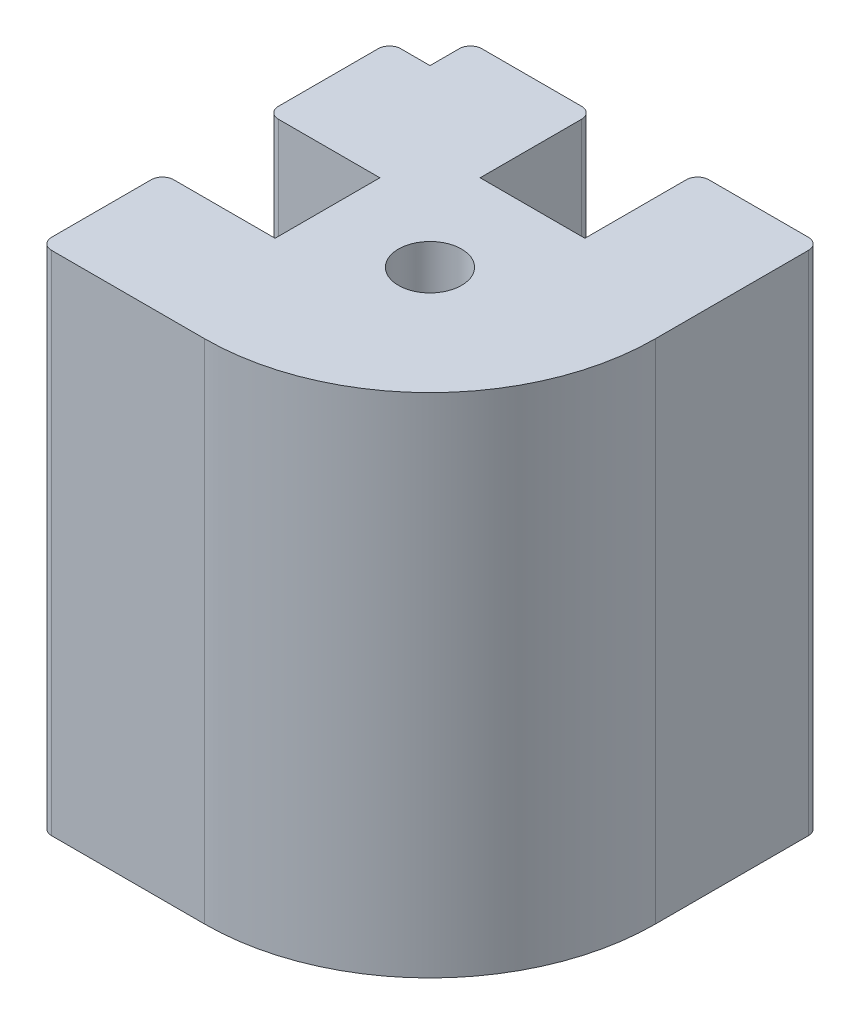
ISO-10303-21;
HEADER;
FILE_DESCRIPTION(('STEP AP214'),'2;1');
FILE_NAME('part.step','',(''),(''),'','','');
FILE_SCHEMA(('AUTOMOTIVE_DESIGN { 1 0 10303 214 1 1 1 1 }'));
ENDSEC;
DATA;
#1=APPLICATION_CONTEXT('core data for automotive mechanical design processes');
#2=APPLICATION_PROTOCOL_DEFINITION('international standard','automotive_design',2000,#1);
#3=PRODUCT_CONTEXT('',#1,'mechanical');
#4=PRODUCT('Part','Part','',(#3));
#5=PRODUCT_RELATED_PRODUCT_CATEGORY('part','',(#4));
#6=PRODUCT_DEFINITION_FORMATION('','',#4);
#7=PRODUCT_DEFINITION_CONTEXT('part definition',#1,'design');
#8=PRODUCT_DEFINITION('design','',#6,#7);
#9=PRODUCT_DEFINITION_SHAPE('','',#8);
#10=(LENGTH_UNIT() NAMED_UNIT(*) SI_UNIT(.MILLI.,.METRE.));
#11=(NAMED_UNIT(*) PLANE_ANGLE_UNIT() SI_UNIT($,.RADIAN.));
#12=(NAMED_UNIT(*) SI_UNIT($,.STERADIAN.) SOLID_ANGLE_UNIT());
#13=UNCERTAINTY_MEASURE_WITH_UNIT(LENGTH_MEASURE(1.E-05),#10,'distance_accuracy_value','');
#14=(GEOMETRIC_REPRESENTATION_CONTEXT(3) GLOBAL_UNCERTAINTY_ASSIGNED_CONTEXT((#13)) GLOBAL_UNIT_ASSIGNED_CONTEXT((#10,
#11,#12)) REPRESENTATION_CONTEXT('',''));
#15=CARTESIAN_POINT('',(0.,0.,0.));
#16=DIRECTION('',(0.,0.,1.));
#17=DIRECTION('',(1.,0.,0.));
#18=AXIS2_PLACEMENT_3D('',#15,#16,#17);
#19=CARTESIAN_POINT('',(0.,45.,0.));
#20=DIRECTION('',(0.,-1.,0.));
#21=DIRECTION('',(0.,0.,-1.));
#22=AXIS2_PLACEMENT_3D('',#19,#20,#21);
#23=PLANE('',#22);
#24=DIRECTION('',(1.,0.,0.));
#25=VECTOR('',#24,1.);
#26=CARTESIAN_POINT('',(15.5,45.,15.5));
#27=LINE('',#26,#25);
#28=CARTESIAN_POINT('',(-18.0991525423729,45.,15.5));
#29=VERTEX_POINT('',#28);
#30=CARTESIAN_POINT('',(-4.49999999999999,45.,15.5));
#31=VERTEX_POINT('',#30);
#32=EDGE_CURVE('E316',#29,#31,#27,.T.);
#33=ORIENTED_EDGE('',*,*,#32,.T.);
#34=CARTESIAN_POINT('',(-4.5,45.,-4.5));
#35=DIRECTION('',(0.,-1.,0.));
#36=DIRECTION('',(0.,0.,-1.));
#37=AXIS2_PLACEMENT_3D('',#34,#35,#36);
#38=CIRCLE('',#37,20.);
#39=CARTESIAN_POINT('',(15.5,45.,-4.5));
#40=VERTEX_POINT('',#39);
#41=EDGE_CURVE('E11',#31,#40,#38,.F.);
#42=ORIENTED_EDGE('',*,*,#41,.T.);
#43=DIRECTION('',(0.,0.,-1.));
#44=VECTOR('',#43,1.);
#45=CARTESIAN_POINT('',(15.5,45.,-19.0991525423729));
#46=LINE('',#45,#44);
#47=CARTESIAN_POINT('',(15.5,45.,-18.0991525423729));
#48=VERTEX_POINT('',#47);
#49=EDGE_CURVE('E444',#40,#48,#46,.T.);
#50=ORIENTED_EDGE('',*,*,#49,.T.);
#51=CARTESIAN_POINT('',(14.5,45.,-18.0991525423729));
#52=DIRECTION('',(0.,-1.,0.));
#53=DIRECTION('',(0.,0.,-1.));
#54=AXIS2_PLACEMENT_3D('',#51,#52,#53);
#55=CIRCLE('',#54,1.);
#56=CARTESIAN_POINT('',(14.5,45.,-19.0991525423729));
#57=VERTEX_POINT('',#56);
#58=EDGE_CURVE('E384',#48,#57,#55,.F.);
#59=ORIENTED_EDGE('',*,*,#58,.T.);
#60=DIRECTION('',(-1.,0.,0.));
#61=VECTOR('',#60,1.);
#62=CARTESIAN_POINT('',(4.65000000000002,45.,-19.0991525423729));
#63=LINE('',#62,#61);
#64=CARTESIAN_POINT('',(5.65000000000002,45.,-19.0991525423729));
#65=VERTEX_POINT('',#64);
#66=EDGE_CURVE('E212',#57,#65,#63,.T.);
#67=ORIENTED_EDGE('',*,*,#66,.T.);
#68=CARTESIAN_POINT('',(5.65000000000002,45.,-18.0991525423729));
#69=DIRECTION('',(0.,-1.,0.));
#70=DIRECTION('',(0.,0.,-1.));
#71=AXIS2_PLACEMENT_3D('',#68,#69,#70);
#72=CIRCLE('',#71,1.);
#73=CARTESIAN_POINT('',(4.65000000000002,45.,-18.0991525423729));
#74=VERTEX_POINT('',#73);
#75=EDGE_CURVE('E207',#65,#74,#72,.F.);
#76=ORIENTED_EDGE('',*,*,#75,.T.);
#77=DIRECTION('',(0.,0.,1.));
#78=VECTOR('',#77,1.);
#79=CARTESIAN_POINT('',(4.64999999999999,45.,-9.09915254237289));
#80=LINE('',#79,#78);
#81=CARTESIAN_POINT('',(4.64999999999999,45.,-9.09915254237289));
#82=VERTEX_POINT('',#81);
#83=EDGE_CURVE('E199',#74,#82,#80,.T.);
#84=ORIENTED_EDGE('',*,*,#83,.T.);
#85=DIRECTION('',(-1.,0.,0.));
#86=VECTOR('',#85,1.);
#87=CARTESIAN_POINT('',(-4.65000000000001,45.,-9.09915254237288));
#88=LINE('',#87,#86);
#89=CARTESIAN_POINT('',(-4.65000000000001,45.,-9.09915254237288));
#90=VERTEX_POINT('',#89);
#91=EDGE_CURVE('E202',#82,#90,#88,.T.);
#92=ORIENTED_EDGE('',*,*,#91,.T.);
#93=DIRECTION('',(0.,0.,-1.));
#94=VECTOR('',#93,1.);
#95=CARTESIAN_POINT('',(-4.65000000000002,45.,-19.0991525423729));
#96=LINE('',#95,#94);
#97=CARTESIAN_POINT('',(-4.65000000000002,45.,-18.0991525423729));
#98=VERTEX_POINT('',#97);
#99=EDGE_CURVE('E231',#90,#98,#96,.T.);
#100=ORIENTED_EDGE('',*,*,#99,.T.);
#101=CARTESIAN_POINT('',(-5.65000000000002,45.,-18.0991525423729));
#102=DIRECTION('',(0.,-1.,0.));
#103=DIRECTION('',(0.,0.,-1.));
#104=AXIS2_PLACEMENT_3D('',#101,#102,#103);
#105=CIRCLE('',#104,1.);
#106=CARTESIAN_POINT('',(-5.65000000000002,45.,-19.0991525423729));
#107=VERTEX_POINT('',#106);
#108=EDGE_CURVE('E379',#98,#107,#105,.F.);
#109=ORIENTED_EDGE('',*,*,#108,.T.);
#110=DIRECTION('',(-1.,0.,0.));
#111=VECTOR('',#110,1.);
#112=CARTESIAN_POINT('',(-15.5,45.,-19.0991525423729));
#113=LINE('',#112,#111);
#114=CARTESIAN_POINT('',(-14.5,45.,-19.0991525423729));
#115=VERTEX_POINT('',#114);
#116=EDGE_CURVE('E233',#107,#115,#113,.T.);
#117=ORIENTED_EDGE('',*,*,#116,.T.);
#118=CARTESIAN_POINT('',(-14.5,45.,-18.0991525423729));
#119=DIRECTION('',(0.,-1.,0.));
#120=DIRECTION('',(0.,0.,-1.));
#121=AXIS2_PLACEMENT_3D('',#118,#119,#120);
#122=CIRCLE('',#121,1.);
#123=CARTESIAN_POINT('',(-15.5,45.,-18.0991525423729));
#124=VERTEX_POINT('',#123);
#125=EDGE_CURVE('E380',#115,#124,#122,.F.);
#126=ORIENTED_EDGE('',*,*,#125,.T.);
#127=DIRECTION('',(0.,0.,1.));
#128=VECTOR('',#127,1.);
#129=CARTESIAN_POINT('',(-15.5,45.,-15.5));
#130=LINE('',#129,#128);
#131=CARTESIAN_POINT('',(-15.5,45.,-15.5));
#132=VERTEX_POINT('',#131);
#133=EDGE_CURVE('E241',#124,#132,#130,.T.);
#134=ORIENTED_EDGE('',*,*,#133,.T.);
#135=DIRECTION('',(-1.,0.,0.));
#136=VECTOR('',#135,1.);
#137=CARTESIAN_POINT('',(-19.0991525423729,45.,-15.5));
#138=LINE('',#137,#136);
#139=CARTESIAN_POINT('',(-18.0991525423729,45.,-15.5));
#140=VERTEX_POINT('',#139);
#141=EDGE_CURVE('E243',#132,#140,#138,.T.);
#142=ORIENTED_EDGE('',*,*,#141,.T.);
#143=CARTESIAN_POINT('',(-18.0991525423729,45.,-14.5));
#144=DIRECTION('',(0.,-1.,0.));
#145=DIRECTION('',(0.,0.,-1.));
#146=AXIS2_PLACEMENT_3D('',#143,#144,#145);
#147=CIRCLE('',#146,1.);
#148=CARTESIAN_POINT('',(-19.0991525423729,45.,-14.5));
#149=VERTEX_POINT('',#148);
#150=EDGE_CURVE('E372',#140,#149,#147,.F.);
#151=ORIENTED_EDGE('',*,*,#150,.T.);
#152=DIRECTION('',(0.,0.,1.));
#153=VECTOR('',#152,1.);
#154=CARTESIAN_POINT('',(-19.0991525423729,45.,-4.65));
#155=LINE('',#154,#153);
#156=CARTESIAN_POINT('',(-19.0991525423729,45.,-5.65));
#157=VERTEX_POINT('',#156);
#158=EDGE_CURVE('E247',#149,#157,#155,.T.);
#159=ORIENTED_EDGE('',*,*,#158,.T.);
#160=CARTESIAN_POINT('',(-18.0991525423729,45.,-5.65));
#161=DIRECTION('',(0.,-1.,0.));
#162=DIRECTION('',(0.,0.,-1.));
#163=AXIS2_PLACEMENT_3D('',#160,#161,#162);
#164=CIRCLE('',#163,1.);
#165=CARTESIAN_POINT('',(-18.0991525423729,45.,-4.65));
#166=VERTEX_POINT('',#165);
#167=EDGE_CURVE('E366',#157,#166,#164,.F.);
#168=ORIENTED_EDGE('',*,*,#167,.T.);
#169=DIRECTION('',(1.,0.,0.));
#170=VECTOR('',#169,1.);
#171=CARTESIAN_POINT('',(-9.09915254237288,45.,-4.65));
#172=LINE('',#171,#170);
#173=CARTESIAN_POINT('',(-9.09915254237288,45.,-4.65));
#174=VERTEX_POINT('',#173);
#175=EDGE_CURVE('E252',#166,#174,#172,.T.);
#176=ORIENTED_EDGE('',*,*,#175,.T.);
#177=DIRECTION('',(0.,0.,1.));
#178=VECTOR('',#177,1.);
#179=CARTESIAN_POINT('',(-9.09915254237288,45.,4.65));
#180=LINE('',#179,#178);
#181=CARTESIAN_POINT('',(-9.09915254237288,45.,4.65));
#182=VERTEX_POINT('',#181);
#183=EDGE_CURVE('E254',#174,#182,#180,.T.);
#184=ORIENTED_EDGE('',*,*,#183,.T.);
#185=DIRECTION('',(-1.,0.,0.));
#186=VECTOR('',#185,1.);
#187=CARTESIAN_POINT('',(-19.0991525423729,45.,4.65));
#188=LINE('',#187,#186);
#189=CARTESIAN_POINT('',(-18.0991525423729,45.,4.65));
#190=VERTEX_POINT('',#189);
#191=EDGE_CURVE('E256',#182,#190,#188,.T.);
#192=ORIENTED_EDGE('',*,*,#191,.T.);
#193=CARTESIAN_POINT('',(-18.0991525423729,45.,5.65));
#194=DIRECTION('',(0.,-1.,0.));
#195=DIRECTION('',(0.,0.,-1.));
#196=AXIS2_PLACEMENT_3D('',#193,#194,#195);
#197=CIRCLE('',#196,1.);
#198=CARTESIAN_POINT('',(-19.0991525423729,45.,5.65));
#199=VERTEX_POINT('',#198);
#200=EDGE_CURVE('E371',#190,#199,#197,.F.);
#201=ORIENTED_EDGE('',*,*,#200,.T.);
#202=DIRECTION('',(0.,0.,1.));
#203=VECTOR('',#202,1.);
#204=CARTESIAN_POINT('',(-19.0991525423729,45.,15.5));
#205=LINE('',#204,#203);
#206=CARTESIAN_POINT('',(-19.0991525423729,45.,14.5));
#207=VERTEX_POINT('',#206);
#208=EDGE_CURVE('E265',#199,#207,#205,.T.);
#209=ORIENTED_EDGE('',*,*,#208,.T.);
#210=CARTESIAN_POINT('',(-18.0991525423729,45.,14.5));
#211=DIRECTION('',(0.,-1.,0.));
#212=DIRECTION('',(0.,0.,-1.));
#213=AXIS2_PLACEMENT_3D('',#210,#211,#212);
#214=CIRCLE('',#213,1.);
#215=EDGE_CURVE('E364',#207,#29,#214,.F.);
#216=ORIENTED_EDGE('',*,*,#215,.T.);
#217=EDGE_LOOP('',(#33,#42,#50,#59,#67,#76,#84,#92,#100,#109,#117,#126,#134,#142,#151,#159,#168,
#176,#184,#192,#201,#209,#216));
#218=FACE_BOUND('',#217,.T.);
#219=CARTESIAN_POINT('',(0.,45.,0.));
#220=DIRECTION('',(0.,1.,0.));
#221=DIRECTION('',(0.,0.,1.));
#222=AXIS2_PLACEMENT_3D('',#219,#220,#221);
#223=CIRCLE('',#222,2.8);
#224=CARTESIAN_POINT('',(0.,45.,-2.8));
#225=VERTEX_POINT('',#224);
#226=EDGE_CURVE('E271',#225,#225,#223,.T.);
#227=ORIENTED_EDGE('',*,*,#226,.F.);
#228=EDGE_LOOP('',(#227));
#229=FACE_BOUND('',#228,.T.);
#230=ADVANCED_FACE('F44',(#218,#229),#23,.F.);
#231=CARTESIAN_POINT('',(0.,0.,0.));
#232=DIRECTION('',(0.,-1.,0.));
#233=DIRECTION('',(0.,0.,-1.));
#234=AXIS2_PLACEMENT_3D('',#231,#232,#233);
#235=PLANE('',#234);
#236=DIRECTION('',(0.,0.,-1.));
#237=VECTOR('',#236,1.);
#238=CARTESIAN_POINT('',(15.5,0.,-19.0991525423729));
#239=LINE('',#238,#237);
#240=CARTESIAN_POINT('',(15.5,0.,-4.5));
#241=VERTEX_POINT('',#240);
#242=CARTESIAN_POINT('',(15.5,0.,-18.0991525423729));
#243=VERTEX_POINT('',#242);
#244=EDGE_CURVE('E269',#241,#243,#239,.T.);
#245=ORIENTED_EDGE('',*,*,#244,.F.);
#246=CARTESIAN_POINT('',(-4.5,0.,-4.5));
#247=DIRECTION('',(0.,-1.,0.));
#248=DIRECTION('',(0.,0.,-1.));
#249=AXIS2_PLACEMENT_3D('',#246,#247,#248);
#250=CIRCLE('',#249,20.);
#251=CARTESIAN_POINT('',(-4.49999999999999,0.,15.5));
#252=VERTEX_POINT('',#251);
#253=EDGE_CURVE('E67',#241,#252,#250,.T.);
#254=ORIENTED_EDGE('',*,*,#253,.T.);
#255=DIRECTION('',(1.,0.,0.));
#256=VECTOR('',#255,1.);
#257=CARTESIAN_POINT('',(15.5,0.,15.5));
#258=LINE('',#257,#256);
#259=CARTESIAN_POINT('',(-18.0991525423729,0.,15.5));
#260=VERTEX_POINT('',#259);
#261=EDGE_CURVE('E270',#260,#252,#258,.T.);
#262=ORIENTED_EDGE('',*,*,#261,.F.);
#263=CARTESIAN_POINT('',(-18.0991525423729,0.,14.5));
#264=DIRECTION('',(0.,-1.,0.));
#265=DIRECTION('',(0.,0.,-1.));
#266=AXIS2_PLACEMENT_3D('',#263,#264,#265);
#267=CIRCLE('',#266,1.);
#268=CARTESIAN_POINT('',(-19.0991525423729,0.,14.5));
#269=VERTEX_POINT('',#268);
#270=EDGE_CURVE('E336',#260,#269,#267,.T.);
#271=ORIENTED_EDGE('',*,*,#270,.T.);
#272=DIRECTION('',(0.,0.,1.));
#273=VECTOR('',#272,1.);
#274=CARTESIAN_POINT('',(-19.0991525423729,0.,15.5));
#275=LINE('',#274,#273);
#276=CARTESIAN_POINT('',(-19.0991525423729,0.,5.65));
#277=VERTEX_POINT('',#276);
#278=EDGE_CURVE('E315',#277,#269,#275,.T.);
#279=ORIENTED_EDGE('',*,*,#278,.F.);
#280=CARTESIAN_POINT('',(-18.0991525423729,0.,5.65));
#281=DIRECTION('',(0.,-1.,0.));
#282=DIRECTION('',(0.,0.,-1.));
#283=AXIS2_PLACEMENT_3D('',#280,#281,#282);
#284=CIRCLE('',#283,1.);
#285=CARTESIAN_POINT('',(-18.0991525423729,0.,4.65));
#286=VERTEX_POINT('',#285);
#287=EDGE_CURVE('E345',#277,#286,#284,.T.);
#288=ORIENTED_EDGE('',*,*,#287,.T.);
#289=DIRECTION('',(-1.,0.,0.));
#290=VECTOR('',#289,1.);
#291=CARTESIAN_POINT('',(-19.0991525423729,0.,4.65));
#292=LINE('',#291,#290);
#293=CARTESIAN_POINT('',(-9.09915254237288,0.,4.65));
#294=VERTEX_POINT('',#293);
#295=EDGE_CURVE('E306',#294,#286,#292,.T.);
#296=ORIENTED_EDGE('',*,*,#295,.F.);
#297=DIRECTION('',(0.,0.,1.));
#298=VECTOR('',#297,1.);
#299=CARTESIAN_POINT('',(-9.09915254237288,0.,4.65));
#300=LINE('',#299,#298);
#301=CARTESIAN_POINT('',(-9.09915254237288,0.,-4.65));
#302=VERTEX_POINT('',#301);
#303=EDGE_CURVE('E304',#302,#294,#300,.T.);
#304=ORIENTED_EDGE('',*,*,#303,.F.);
#305=DIRECTION('',(1.,0.,0.));
#306=VECTOR('',#305,1.);
#307=CARTESIAN_POINT('',(-9.09915254237288,0.,-4.65));
#308=LINE('',#307,#306);
#309=CARTESIAN_POINT('',(-18.0991525423729,0.,-4.65));
#310=VERTEX_POINT('',#309);
#311=EDGE_CURVE('E305',#310,#302,#308,.T.);
#312=ORIENTED_EDGE('',*,*,#311,.F.);
#313=CARTESIAN_POINT('',(-18.0991525423729,0.,-5.65));
#314=DIRECTION('',(0.,-1.,0.));
#315=DIRECTION('',(0.,0.,-1.));
#316=AXIS2_PLACEMENT_3D('',#313,#314,#315);
#317=CIRCLE('',#316,1.);
#318=CARTESIAN_POINT('',(-19.0991525423729,0.,-5.65));
#319=VERTEX_POINT('',#318);
#320=EDGE_CURVE('E338',#310,#319,#317,.T.);
#321=ORIENTED_EDGE('',*,*,#320,.T.);
#322=DIRECTION('',(0.,0.,1.));
#323=VECTOR('',#322,1.);
#324=CARTESIAN_POINT('',(-19.0991525423729,0.,-4.65));
#325=LINE('',#324,#323);
#326=CARTESIAN_POINT('',(-19.0991525423729,0.,-14.5));
#327=VERTEX_POINT('',#326);
#328=EDGE_CURVE('E297',#327,#319,#325,.T.);
#329=ORIENTED_EDGE('',*,*,#328,.F.);
#330=CARTESIAN_POINT('',(-18.0991525423729,0.,-14.5));
#331=DIRECTION('',(0.,-1.,0.));
#332=DIRECTION('',(0.,0.,-1.));
#333=AXIS2_PLACEMENT_3D('',#330,#331,#332);
#334=CIRCLE('',#333,1.);
#335=CARTESIAN_POINT('',(-18.0991525423729,0.,-15.5));
#336=VERTEX_POINT('',#335);
#337=EDGE_CURVE('E344',#327,#336,#334,.T.);
#338=ORIENTED_EDGE('',*,*,#337,.T.);
#339=DIRECTION('',(-1.,0.,0.));
#340=VECTOR('',#339,1.);
#341=CARTESIAN_POINT('',(-19.0991525423729,0.,-15.5));
#342=LINE('',#341,#340);
#343=CARTESIAN_POINT('',(-15.5,0.,-15.5));
#344=VERTEX_POINT('',#343);
#345=EDGE_CURVE('E294',#344,#336,#342,.T.);
#346=ORIENTED_EDGE('',*,*,#345,.F.);
#347=DIRECTION('',(0.,0.,1.));
#348=VECTOR('',#347,1.);
#349=CARTESIAN_POINT('',(-15.5,0.,-15.5));
#350=LINE('',#349,#348);
#351=CARTESIAN_POINT('',(-15.5,0.,-18.0991525423729));
#352=VERTEX_POINT('',#351);
#353=EDGE_CURVE('E292',#352,#344,#350,.T.);
#354=ORIENTED_EDGE('',*,*,#353,.F.);
#355=CARTESIAN_POINT('',(-14.5,0.,-18.0991525423729));
#356=DIRECTION('',(0.,-1.,0.));
#357=DIRECTION('',(0.,0.,-1.));
#358=AXIS2_PLACEMENT_3D('',#355,#356,#357);
#359=CIRCLE('',#358,1.);
#360=CARTESIAN_POINT('',(-14.5,0.,-19.0991525423729));
#361=VERTEX_POINT('',#360);
#362=EDGE_CURVE('E346',#352,#361,#359,.T.);
#363=ORIENTED_EDGE('',*,*,#362,.T.);
#364=DIRECTION('',(-1.,0.,0.));
#365=VECTOR('',#364,1.);
#366=CARTESIAN_POINT('',(-15.5,0.,-19.0991525423729));
#367=LINE('',#366,#365);
#368=CARTESIAN_POINT('',(-5.65000000000002,0.,-19.0991525423729));
#369=VERTEX_POINT('',#368);
#370=EDGE_CURVE('E290',#369,#361,#367,.T.);
#371=ORIENTED_EDGE('',*,*,#370,.F.);
#372=CARTESIAN_POINT('',(-5.65000000000002,0.,-18.0991525423729));
#373=DIRECTION('',(0.,-1.,0.));
#374=DIRECTION('',(0.,0.,-1.));
#375=AXIS2_PLACEMENT_3D('',#372,#373,#374);
#376=CIRCLE('',#375,1.);
#377=CARTESIAN_POINT('',(-4.65000000000002,0.,-18.0991525423729));
#378=VERTEX_POINT('',#377);
#379=EDGE_CURVE('E351',#369,#378,#376,.T.);
#380=ORIENTED_EDGE('',*,*,#379,.T.);
#381=DIRECTION('',(0.,0.,-1.));
#382=VECTOR('',#381,1.);
#383=CARTESIAN_POINT('',(-4.65000000000002,0.,-19.0991525423729));
#384=LINE('',#383,#382);
#385=CARTESIAN_POINT('',(-4.65000000000001,0.,-9.09915254237288));
#386=VERTEX_POINT('',#385);
#387=EDGE_CURVE('E282',#386,#378,#384,.T.);
#388=ORIENTED_EDGE('',*,*,#387,.F.);
#389=DIRECTION('',(-1.,0.,0.));
#390=VECTOR('',#389,1.);
#391=CARTESIAN_POINT('',(-4.65000000000001,0.,-9.09915254237288));
#392=LINE('',#391,#390);
#393=CARTESIAN_POINT('',(4.64999999999999,0.,-9.09915254237289));
#394=VERTEX_POINT('',#393);
#395=EDGE_CURVE('E278',#394,#386,#392,.T.);
#396=ORIENTED_EDGE('',*,*,#395,.F.);
#397=DIRECTION('',(0.,0.,1.));
#398=VECTOR('',#397,1.);
#399=CARTESIAN_POINT('',(4.64999999999999,0.,-9.09915254237289));
#400=LINE('',#399,#398);
#401=CARTESIAN_POINT('',(4.65000000000002,0.,-18.0991525423729));
#402=VERTEX_POINT('',#401);
#403=EDGE_CURVE('E219',#402,#394,#400,.T.);
#404=ORIENTED_EDGE('',*,*,#403,.F.);
#405=CARTESIAN_POINT('',(5.65000000000002,0.,-18.0991525423729));
#406=DIRECTION('',(0.,-1.,0.));
#407=DIRECTION('',(0.,0.,-1.));
#408=AXIS2_PLACEMENT_3D('',#405,#406,#407);
#409=CIRCLE('',#408,1.);
#410=CARTESIAN_POINT('',(5.65000000000002,0.,-19.0991525423729));
#411=VERTEX_POINT('',#410);
#412=EDGE_CURVE('E353',#402,#411,#409,.T.);
#413=ORIENTED_EDGE('',*,*,#412,.T.);
#414=DIRECTION('',(-1.,0.,0.));
#415=VECTOR('',#414,1.);
#416=CARTESIAN_POINT('',(4.65000000000002,0.,-19.0991525423729));
#417=LINE('',#416,#415);
#418=CARTESIAN_POINT('',(14.5,0.,-19.0991525423729));
#419=VERTEX_POINT('',#418);
#420=EDGE_CURVE('E273',#419,#411,#417,.T.);
#421=ORIENTED_EDGE('',*,*,#420,.F.);
#422=CARTESIAN_POINT('',(14.5,0.,-18.0991525423729));
#423=DIRECTION('',(0.,-1.,0.));
#424=DIRECTION('',(0.,0.,-1.));
#425=AXIS2_PLACEMENT_3D('',#422,#423,#424);
#426=CIRCLE('',#425,1.);
#427=EDGE_CURVE('E360',#419,#243,#426,.T.);
#428=ORIENTED_EDGE('',*,*,#427,.T.);
#429=EDGE_LOOP('',(#245,#254,#262,#271,#279,#288,#296,#304,#312,#321,#329,#338,#346,#354,#363,
#371,#380,#388,#396,#404,#413,#421,#428));
#430=FACE_BOUND('',#429,.T.);
#431=CARTESIAN_POINT('',(0.,0.,0.));
#432=DIRECTION('',(0.,1.,0.));
#433=DIRECTION('',(0.,0.,1.));
#434=AXIS2_PLACEMENT_3D('',#431,#432,#433);
#435=CIRCLE('',#434,2.8);
#436=CARTESIAN_POINT('',(0.,0.,-2.8));
#437=VERTEX_POINT('',#436);
#438=EDGE_CURVE('E463',#437,#437,#435,.T.);
#439=ORIENTED_EDGE('',*,*,#438,.T.);
#440=EDGE_LOOP('',(#439));
#441=FACE_BOUND('',#440,.T.);
#442=ADVANCED_FACE('F446',(#430,#441),#235,.T.);
#443=CARTESIAN_POINT('',(15.5,45.,15.5));
#444=DIRECTION('',(0.,0.,-1.));
#445=DIRECTION('',(-1.,0.,0.));
#446=AXIS2_PLACEMENT_3D('',#443,#444,#445);
#447=PLANE('',#446);
#448=ORIENTED_EDGE('',*,*,#261,.T.);
#449=DIRECTION('',(0.,-1.,0.));
#450=VECTOR('',#449,1.);
#451=CARTESIAN_POINT('',(-4.49999999999999,45.,15.5));
#452=LINE('',#451,#450);
#453=EDGE_CURVE('E53',#252,#31,#452,.F.);
#454=ORIENTED_EDGE('',*,*,#453,.T.);
#455=ORIENTED_EDGE('',*,*,#32,.F.);
#456=DIRECTION('',(0.,-1.,0.));
#457=VECTOR('',#456,1.);
#458=CARTESIAN_POINT('',(-18.0991525423729,45.,15.5));
#459=LINE('',#458,#457);
#460=EDGE_CURVE('E427',#29,#260,#459,.T.);
#461=ORIENTED_EDGE('',*,*,#460,.T.);
#462=EDGE_LOOP('',(#448,#454,#455,#461));
#463=FACE_BOUND('',#462,.T.);
#464=ADVANCED_FACE('F477',(#463),#447,.F.);
#465=CARTESIAN_POINT('',(15.5,45.,-19.0991525423729));
#466=DIRECTION('',(-1.,0.,0.));
#467=DIRECTION('',(0.,0.,1.));
#468=AXIS2_PLACEMENT_3D('',#465,#466,#467);
#469=PLANE('',#468);
#470=ORIENTED_EDGE('',*,*,#49,.F.);
#471=DIRECTION('',(0.,-1.,0.));
#472=VECTOR('',#471,1.);
#473=CARTESIAN_POINT('',(15.5,45.,-4.5));
#474=LINE('',#473,#472);
#475=EDGE_CURVE('E433',#40,#241,#474,.T.);
#476=ORIENTED_EDGE('',*,*,#475,.T.);
#477=ORIENTED_EDGE('',*,*,#244,.T.);
#478=DIRECTION('',(0.,-1.,0.));
#479=VECTOR('',#478,1.);
#480=CARTESIAN_POINT('',(15.5,45.,-18.0991525423729));
#481=LINE('',#480,#479);
#482=EDGE_CURVE('E363',#243,#48,#481,.F.);
#483=ORIENTED_EDGE('',*,*,#482,.T.);
#484=EDGE_LOOP('',(#470,#476,#477,#483));
#485=FACE_BOUND('',#484,.T.);
#486=ADVANCED_FACE('F445',(#485),#469,.F.);
#487=CARTESIAN_POINT('',(4.65000000000002,45.,-19.0991525423729));
#488=DIRECTION('',(0.,0.,1.));
#489=DIRECTION('',(1.,0.,0.));
#490=AXIS2_PLACEMENT_3D('',#487,#488,#489);
#491=PLANE('',#490);
#492=ORIENTED_EDGE('',*,*,#66,.F.);
#493=DIRECTION('',(0.,-1.,0.));
#494=VECTOR('',#493,1.);
#495=CARTESIAN_POINT('',(14.5,45.,-19.0991525423729));
#496=LINE('',#495,#494);
#497=EDGE_CURVE('E335',#57,#419,#496,.T.);
#498=ORIENTED_EDGE('',*,*,#497,.T.);
#499=ORIENTED_EDGE('',*,*,#420,.T.);
#500=DIRECTION('',(0.,-1.,0.));
#501=VECTOR('',#500,1.);
#502=CARTESIAN_POINT('',(5.65000000000002,45.,-19.0991525423729));
#503=LINE('',#502,#501);
#504=EDGE_CURVE('E221',#411,#65,#503,.F.);
#505=ORIENTED_EDGE('',*,*,#504,.T.);
#506=EDGE_LOOP('',(#492,#498,#499,#505));
#507=FACE_BOUND('',#506,.T.);
#508=ADVANCED_FACE('F457',(#507),#491,.F.);
#509=CARTESIAN_POINT('',(4.64999999999999,45.,-9.09915254237289));
#510=DIRECTION('',(1.,0.,0.));
#511=DIRECTION('',(0.,0.,-1.));
#512=AXIS2_PLACEMENT_3D('',#509,#510,#511);
#513=PLANE('',#512);
#514=ORIENTED_EDGE('',*,*,#83,.F.);
#515=DIRECTION('',(0.,-1.,0.));
#516=VECTOR('',#515,1.);
#517=CARTESIAN_POINT('',(4.65000000000002,45.,-18.0991525423729));
#518=LINE('',#517,#516);
#519=EDGE_CURVE('E389',#74,#402,#518,.T.);
#520=ORIENTED_EDGE('',*,*,#519,.T.);
#521=ORIENTED_EDGE('',*,*,#403,.T.);
#522=DIRECTION('',(0.,-1.,0.));
#523=VECTOR('',#522,1.);
#524=CARTESIAN_POINT('',(4.64999999999999,45.,-9.09915254237289));
#525=LINE('',#524,#523);
#526=EDGE_CURVE('E220',#82,#394,#525,.T.);
#527=ORIENTED_EDGE('',*,*,#526,.F.);
#528=EDGE_LOOP('',(#514,#520,#521,#527));
#529=FACE_BOUND('',#528,.T.);
#530=ADVANCED_FACE('F217',(#529),#513,.F.);
#531=CARTESIAN_POINT('',(-4.65000000000001,45.,-9.09915254237288));
#532=DIRECTION('',(0.,0.,1.));
#533=DIRECTION('',(1.,0.,0.));
#534=AXIS2_PLACEMENT_3D('',#531,#532,#533);
#535=PLANE('',#534);
#536=ORIENTED_EDGE('',*,*,#395,.T.);
#537=DIRECTION('',(0.,-1.,0.));
#538=VECTOR('',#537,1.);
#539=CARTESIAN_POINT('',(-4.65000000000001,45.,-9.09915254237288));
#540=LINE('',#539,#538);
#541=EDGE_CURVE('E223',#90,#386,#540,.T.);
#542=ORIENTED_EDGE('',*,*,#541,.F.);
#543=ORIENTED_EDGE('',*,*,#91,.F.);
#544=ORIENTED_EDGE('',*,*,#526,.T.);
#545=EDGE_LOOP('',(#536,#542,#543,#544));
#546=FACE_BOUND('',#545,.T.);
#547=ADVANCED_FACE('F230',(#546),#535,.F.);
#548=CARTESIAN_POINT('',(-4.65000000000002,45.,-19.0991525423729));
#549=DIRECTION('',(-1.,0.,0.));
#550=DIRECTION('',(0.,0.,1.));
#551=AXIS2_PLACEMENT_3D('',#548,#549,#550);
#552=PLANE('',#551);
#553=ORIENTED_EDGE('',*,*,#387,.T.);
#554=DIRECTION('',(0.,-1.,0.));
#555=VECTOR('',#554,1.);
#556=CARTESIAN_POINT('',(-4.65000000000002,45.,-18.0991525423729));
#557=LINE('',#556,#555);
#558=EDGE_CURVE('E397',#378,#98,#557,.F.);
#559=ORIENTED_EDGE('',*,*,#558,.T.);
#560=ORIENTED_EDGE('',*,*,#99,.F.);
#561=ORIENTED_EDGE('',*,*,#541,.T.);
#562=EDGE_LOOP('',(#553,#559,#560,#561));
#563=FACE_BOUND('',#562,.T.);
#564=ADVANCED_FACE('F513',(#563),#552,.F.);
#565=CARTESIAN_POINT('',(-15.5,45.,-19.0991525423729));
#566=DIRECTION('',(0.,0.,1.));
#567=DIRECTION('',(1.,0.,0.));
#568=AXIS2_PLACEMENT_3D('',#565,#566,#567);
#569=PLANE('',#568);
#570=ORIENTED_EDGE('',*,*,#116,.F.);
#571=DIRECTION('',(0.,-1.,0.));
#572=VECTOR('',#571,1.);
#573=CARTESIAN_POINT('',(-5.65000000000002,45.,-19.0991525423729));
#574=LINE('',#573,#572);
#575=EDGE_CURVE('E393',#107,#369,#574,.T.);
#576=ORIENTED_EDGE('',*,*,#575,.T.);
#577=ORIENTED_EDGE('',*,*,#370,.T.);
#578=DIRECTION('',(0.,-1.,0.));
#579=VECTOR('',#578,1.);
#580=CARTESIAN_POINT('',(-14.5,45.,-19.0991525423729));
#581=LINE('',#580,#579);
#582=EDGE_CURVE('E391',#361,#115,#581,.F.);
#583=ORIENTED_EDGE('',*,*,#582,.T.);
#584=EDGE_LOOP('',(#570,#576,#577,#583));
#585=FACE_BOUND('',#584,.T.);
#586=ADVANCED_FACE('F512',(#585),#569,.F.);
#587=CARTESIAN_POINT('',(-15.5,45.,-15.5));
#588=DIRECTION('',(1.,0.,0.));
#589=DIRECTION('',(0.,0.,-1.));
#590=AXIS2_PLACEMENT_3D('',#587,#588,#589);
#591=PLANE('',#590);
#592=ORIENTED_EDGE('',*,*,#133,.F.);
#593=DIRECTION('',(0.,-1.,0.));
#594=VECTOR('',#593,1.);
#595=CARTESIAN_POINT('',(-15.5,45.,-18.0991525423729));
#596=LINE('',#595,#594);
#597=EDGE_CURVE('E402',#124,#352,#596,.T.);
#598=ORIENTED_EDGE('',*,*,#597,.T.);
#599=ORIENTED_EDGE('',*,*,#353,.T.);
#600=DIRECTION('',(0.,-1.,0.));
#601=VECTOR('',#600,1.);
#602=CARTESIAN_POINT('',(-15.5,45.,-15.5));
#603=LINE('',#602,#601);
#604=EDGE_CURVE('E322',#132,#344,#603,.T.);
#605=ORIENTED_EDGE('',*,*,#604,.F.);
#606=EDGE_LOOP('',(#592,#598,#599,#605));
#607=FACE_BOUND('',#606,.T.);
#608=ADVANCED_FACE('F510',(#607),#591,.F.);
#609=CARTESIAN_POINT('',(-19.0991525423729,45.,-15.5));
#610=DIRECTION('',(0.,0.,1.));
#611=DIRECTION('',(1.,0.,0.));
#612=AXIS2_PLACEMENT_3D('',#609,#610,#611);
#613=PLANE('',#612);
#614=ORIENTED_EDGE('',*,*,#345,.T.);
#615=DIRECTION('',(0.,-1.,0.));
#616=VECTOR('',#615,1.);
#617=CARTESIAN_POINT('',(-18.0991525423729,45.,-15.5));
#618=LINE('',#617,#616);
#619=EDGE_CURVE('E415',#336,#140,#618,.F.);
#620=ORIENTED_EDGE('',*,*,#619,.T.);
#621=ORIENTED_EDGE('',*,*,#141,.F.);
#622=ORIENTED_EDGE('',*,*,#604,.T.);
#623=EDGE_LOOP('',(#614,#620,#621,#622));
#624=FACE_BOUND('',#623,.T.);
#625=ADVANCED_FACE('F502',(#624),#613,.F.);
#626=CARTESIAN_POINT('',(-19.0991525423729,45.,-4.65));
#627=DIRECTION('',(1.,0.,0.));
#628=DIRECTION('',(0.,0.,-1.));
#629=AXIS2_PLACEMENT_3D('',#626,#627,#628);
#630=PLANE('',#629);
#631=ORIENTED_EDGE('',*,*,#158,.F.);
#632=DIRECTION('',(0.,-1.,0.));
#633=VECTOR('',#632,1.);
#634=CARTESIAN_POINT('',(-19.0991525423729,45.,-14.5));
#635=LINE('',#634,#633);
#636=EDGE_CURVE('E407',#149,#327,#635,.T.);
#637=ORIENTED_EDGE('',*,*,#636,.T.);
#638=ORIENTED_EDGE('',*,*,#328,.T.);
#639=DIRECTION('',(0.,-1.,0.));
#640=VECTOR('',#639,1.);
#641=CARTESIAN_POINT('',(-19.0991525423729,45.,-5.65));
#642=LINE('',#641,#640);
#643=EDGE_CURVE('E403',#319,#157,#642,.F.);
#644=ORIENTED_EDGE('',*,*,#643,.T.);
#645=EDGE_LOOP('',(#631,#637,#638,#644));
#646=FACE_BOUND('',#645,.T.);
#647=ADVANCED_FACE('F496',(#646),#630,.F.);
#648=CARTESIAN_POINT('',(-9.09915254237288,45.,-4.65));
#649=DIRECTION('',(0.,0.,-1.));
#650=DIRECTION('',(-1.,0.,0.));
#651=AXIS2_PLACEMENT_3D('',#648,#649,#650);
#652=PLANE('',#651);
#653=ORIENTED_EDGE('',*,*,#175,.F.);
#654=DIRECTION('',(0.,-1.,0.));
#655=VECTOR('',#654,1.);
#656=CARTESIAN_POINT('',(-18.0991525423729,45.,-4.65));
#657=LINE('',#656,#655);
#658=EDGE_CURVE('E422',#166,#310,#657,.T.);
#659=ORIENTED_EDGE('',*,*,#658,.T.);
#660=ORIENTED_EDGE('',*,*,#311,.T.);
#661=DIRECTION('',(0.,-1.,0.));
#662=VECTOR('',#661,1.);
#663=CARTESIAN_POINT('',(-9.09915254237288,45.,-4.65));
#664=LINE('',#663,#662);
#665=EDGE_CURVE('E319',#174,#302,#664,.T.);
#666=ORIENTED_EDGE('',*,*,#665,.F.);
#667=EDGE_LOOP('',(#653,#659,#660,#666));
#668=FACE_BOUND('',#667,.T.);
#669=ADVANCED_FACE('F494',(#668),#652,.F.);
#670=CARTESIAN_POINT('',(-9.09915254237288,45.,4.65));
#671=DIRECTION('',(1.,0.,0.));
#672=DIRECTION('',(0.,0.,-1.));
#673=AXIS2_PLACEMENT_3D('',#670,#671,#672);
#674=PLANE('',#673);
#675=ORIENTED_EDGE('',*,*,#303,.T.);
#676=DIRECTION('',(0.,-1.,0.));
#677=VECTOR('',#676,1.);
#678=CARTESIAN_POINT('',(-9.09915254237288,45.,4.65));
#679=LINE('',#678,#677);
#680=EDGE_CURVE('E266',#182,#294,#679,.T.);
#681=ORIENTED_EDGE('',*,*,#680,.F.);
#682=ORIENTED_EDGE('',*,*,#183,.F.);
#683=ORIENTED_EDGE('',*,*,#665,.T.);
#684=EDGE_LOOP('',(#675,#681,#682,#683));
#685=FACE_BOUND('',#684,.T.);
#686=ADVANCED_FACE('F491',(#685),#674,.F.);
#687=CARTESIAN_POINT('',(-19.0991525423729,45.,4.65));
#688=DIRECTION('',(0.,0.,1.));
#689=DIRECTION('',(1.,0.,0.));
#690=AXIS2_PLACEMENT_3D('',#687,#688,#689);
#691=PLANE('',#690);
#692=ORIENTED_EDGE('',*,*,#295,.T.);
#693=DIRECTION('',(0.,-1.,0.));
#694=VECTOR('',#693,1.);
#695=CARTESIAN_POINT('',(-18.0991525423729,45.,4.65));
#696=LINE('',#695,#694);
#697=EDGE_CURVE('E425',#286,#190,#696,.F.);
#698=ORIENTED_EDGE('',*,*,#697,.T.);
#699=ORIENTED_EDGE('',*,*,#191,.F.);
#700=ORIENTED_EDGE('',*,*,#680,.T.);
#701=EDGE_LOOP('',(#692,#698,#699,#700));
#702=FACE_BOUND('',#701,.T.);
#703=ADVANCED_FACE('F490',(#702),#691,.F.);
#704=CARTESIAN_POINT('',(-19.0991525423729,45.,15.5));
#705=DIRECTION('',(1.,0.,0.));
#706=DIRECTION('',(0.,0.,-1.));
#707=AXIS2_PLACEMENT_3D('',#704,#705,#706);
#708=PLANE('',#707);
#709=ORIENTED_EDGE('',*,*,#208,.F.);
#710=DIRECTION('',(0.,-1.,0.));
#711=VECTOR('',#710,1.);
#712=CARTESIAN_POINT('',(-19.0991525423729,45.,5.65));
#713=LINE('',#712,#711);
#714=EDGE_CURVE('E416',#199,#277,#713,.T.);
#715=ORIENTED_EDGE('',*,*,#714,.T.);
#716=ORIENTED_EDGE('',*,*,#278,.T.);
#717=DIRECTION('',(0.,-1.,0.));
#718=VECTOR('',#717,1.);
#719=CARTESIAN_POINT('',(-19.0991525423729,45.,14.5));
#720=LINE('',#719,#718);
#721=EDGE_CURVE('E414',#269,#207,#720,.F.);
#722=ORIENTED_EDGE('',*,*,#721,.T.);
#723=EDGE_LOOP('',(#709,#715,#716,#722));
#724=FACE_BOUND('',#723,.T.);
#725=ADVANCED_FACE('F482',(#724),#708,.F.);
#726=CARTESIAN_POINT('',(0.,45.,0.));
#727=DIRECTION('',(0.,-1.,0.));
#728=DIRECTION('',(0.,0.,-1.));
#729=AXIS2_PLACEMENT_3D('',#726,#727,#728);
#730=CYLINDRICAL_SURFACE('',#729,2.8);
#731=CARTESIAN_POINT('',(0.,45.,-2.8));
#732=CARTESIAN_POINT('',(0.,44.53125,-2.8));
#733=CARTESIAN_POINT('',(0.,44.0625,-2.8));
#734=CARTESIAN_POINT('',(0.,43.125,-2.8));
#735=CARTESIAN_POINT('',(0.,42.65625,-2.8));
#736=CARTESIAN_POINT('',(0.,41.71875,-2.8));
#737=CARTESIAN_POINT('',(0.,41.25,-2.8));
#738=CARTESIAN_POINT('',(0.,40.3125,-2.8));
#739=CARTESIAN_POINT('',(0.,39.84375,-2.8));
#740=CARTESIAN_POINT('',(0.,38.90625,-2.8));
#741=CARTESIAN_POINT('',(0.,38.4375,-2.8));
#742=CARTESIAN_POINT('',(0.,37.5,-2.8));
#743=CARTESIAN_POINT('',(0.,37.03125,-2.8));
#744=CARTESIAN_POINT('',(0.,36.09375,-2.8));
#745=CARTESIAN_POINT('',(0.,35.625,-2.8));
#746=CARTESIAN_POINT('',(0.,34.6875,-2.8));
#747=CARTESIAN_POINT('',(0.,34.21875,-2.8));
#748=CARTESIAN_POINT('',(0.,33.28125,-2.8));
#749=CARTESIAN_POINT('',(0.,32.8125,-2.8));
#750=CARTESIAN_POINT('',(0.,31.875,-2.8));
#751=CARTESIAN_POINT('',(0.,31.40625,-2.8));
#752=CARTESIAN_POINT('',(0.,30.46875,-2.8));
#753=CARTESIAN_POINT('',(0.,30.,-2.8));
#754=CARTESIAN_POINT('',(0.,29.0625,-2.8));
#755=CARTESIAN_POINT('',(0.,28.59375,-2.8));
#756=CARTESIAN_POINT('',(0.,27.65625,-2.8));
#757=CARTESIAN_POINT('',(0.,27.1875,-2.8));
#758=CARTESIAN_POINT('',(0.,26.25,-2.8));
#759=CARTESIAN_POINT('',(0.,25.78125,-2.8));
#760=CARTESIAN_POINT('',(0.,24.84375,-2.8));
#761=CARTESIAN_POINT('',(0.,24.375,-2.8));
#762=CARTESIAN_POINT('',(0.,23.4375,-2.8));
#763=CARTESIAN_POINT('',(0.,22.96875,-2.8));
#764=CARTESIAN_POINT('',(0.,22.03125,-2.8));
#765=CARTESIAN_POINT('',(0.,21.5625,-2.8));
#766=CARTESIAN_POINT('',(0.,20.625,-2.8));
#767=CARTESIAN_POINT('',(0.,20.15625,-2.8));
#768=CARTESIAN_POINT('',(0.,19.21875,-2.8));
#769=CARTESIAN_POINT('',(0.,18.75,-2.8));
#770=CARTESIAN_POINT('',(0.,17.8125,-2.8));
#771=CARTESIAN_POINT('',(0.,17.34375,-2.8));
#772=CARTESIAN_POINT('',(0.,16.40625,-2.8));
#773=CARTESIAN_POINT('',(0.,15.9375,-2.8));
#774=CARTESIAN_POINT('',(0.,15.,-2.8));
#775=CARTESIAN_POINT('',(0.,14.53125,-2.8));
#776=CARTESIAN_POINT('',(0.,13.59375,-2.8));
#777=CARTESIAN_POINT('',(0.,13.125,-2.8));
#778=CARTESIAN_POINT('',(0.,12.1875,-2.8));
#779=CARTESIAN_POINT('',(0.,11.71875,-2.8));
#780=CARTESIAN_POINT('',(0.,10.78125,-2.8));
#781=CARTESIAN_POINT('',(0.,10.3125,-2.8));
#782=CARTESIAN_POINT('',(0.,9.37499999999999,-2.8));
#783=CARTESIAN_POINT('',(0.,8.90624999999999,-2.8));
#784=CARTESIAN_POINT('',(0.,7.96874999999999,-2.8));
#785=CARTESIAN_POINT('',(0.,7.5,-2.8));
#786=CARTESIAN_POINT('',(0.,6.56249999999999,-2.8));
#787=CARTESIAN_POINT('',(0.,6.09374999999999,-2.8));
#788=CARTESIAN_POINT('',(0.,5.15624999999999,-2.8));
#789=CARTESIAN_POINT('',(0.,4.68749999999999,-2.8));
#790=CARTESIAN_POINT('',(0.,3.74999999999999,-2.8));
#791=CARTESIAN_POINT('',(0.,3.28124999999999,-2.8));
#792=CARTESIAN_POINT('',(0.,2.34374999999999,-2.8));
#793=CARTESIAN_POINT('',(0.,1.87499999999999,-2.8));
#794=CARTESIAN_POINT('',(0.,0.937499999999992,-2.8));
#795=CARTESIAN_POINT('',(0.,0.468749999999993,-2.8));
#796=CARTESIAN_POINT('',(0.,0.,-2.8));
#797=B_SPLINE_CURVE_WITH_KNOTS('',3,(#731,#732,#733,#734,#735,#736,#737,#738,#739,#740,#741,
#742,#743,#744,#745,#746,#747,#748,#749,#750,#751,#752,#753,#754,#755,#756,#757,#758,#759,#760,
#761,#762,#763,#764,#765,#766,#767,#768,#769,#770,#771,#772,#773,#774,#775,#776,#777,#778,#779,
#780,#781,#782,#783,#784,#785,#786,#787,#788,#789,#790,#791,#792,#793,#794,#795,#796),
.UNSPECIFIED.,.F.,.F.,(4,2,2,2,2,2,2,2,2,2,2,2,2,2,2,2,2,2,2,2,2,2,2,2,2,2,2,2,2,2,2,2,4),(0.,
1.40625,2.8125,4.21874999999999,5.625,7.03125,8.43749999999999,9.84375,11.25,12.65625,14.0625,
15.46875,16.875,18.28125,19.6875,21.09375,22.5,23.90625,25.3125,26.71875,28.125,29.53125,
30.9375,32.34375,33.75,35.15625,36.5625,37.96875,39.375,40.78125,42.1875,43.59375,45.),.UNSPECIFIED.);
#798=EDGE_CURVE('BSEAM472',#225,#437,#797,.T.);
#799=ORIENTED_EDGE('',*,*,#226,.T.);
#800=ORIENTED_EDGE('',*,*,#438,.F.);
#801=ORIENTED_EDGE('',*,*,#798,.T.);
#802=ORIENTED_EDGE('',*,*,#798,.F.);
#803=EDGE_LOOP('',(#799,#801,#800,#802));
#804=FACE_BOUND('',#803,.T.);
#805=ADVANCED_FACE('F472',(#804),#730,.F.);
#806=CARTESIAN_POINT('',(14.5,45.,-18.0991525423729));
#807=DIRECTION('',(0.,-1.,0.));
#808=DIRECTION('',(0.,0.,-1.));
#809=AXIS2_PLACEMENT_3D('',#806,#807,#808);
#810=CYLINDRICAL_SURFACE('',#809,1.);
#811=ORIENTED_EDGE('',*,*,#58,.F.);
#812=ORIENTED_EDGE('',*,*,#482,.F.);
#813=ORIENTED_EDGE('',*,*,#427,.F.);
#814=ORIENTED_EDGE('',*,*,#497,.F.);
#815=EDGE_LOOP('',(#811,#812,#813,#814));
#816=FACE_BOUND('',#815,.T.);
#817=ADVANCED_FACE('F452',(#816),#810,.T.);
#818=CARTESIAN_POINT('',(5.65000000000002,45.,-18.0991525423729));
#819=DIRECTION('',(0.,-1.,0.));
#820=DIRECTION('',(0.,0.,-1.));
#821=AXIS2_PLACEMENT_3D('',#818,#819,#820);
#822=CYLINDRICAL_SURFACE('',#821,1.);
#823=ORIENTED_EDGE('',*,*,#75,.F.);
#824=ORIENTED_EDGE('',*,*,#504,.F.);
#825=ORIENTED_EDGE('',*,*,#412,.F.);
#826=ORIENTED_EDGE('',*,*,#519,.F.);
#827=EDGE_LOOP('',(#823,#824,#825,#826));
#828=FACE_BOUND('',#827,.T.);
#829=ADVANCED_FACE('F535',(#828),#822,.T.);
#830=CARTESIAN_POINT('',(-5.65000000000002,45.,-18.0991525423729));
#831=DIRECTION('',(0.,-1.,0.));
#832=DIRECTION('',(0.,0.,-1.));
#833=AXIS2_PLACEMENT_3D('',#830,#831,#832);
#834=CYLINDRICAL_SURFACE('',#833,1.);
#835=ORIENTED_EDGE('',*,*,#108,.F.);
#836=ORIENTED_EDGE('',*,*,#558,.F.);
#837=ORIENTED_EDGE('',*,*,#379,.F.);
#838=ORIENTED_EDGE('',*,*,#575,.F.);
#839=EDGE_LOOP('',(#835,#836,#837,#838));
#840=FACE_BOUND('',#839,.T.);
#841=ADVANCED_FACE('F532',(#840),#834,.T.);
#842=CARTESIAN_POINT('',(-14.5,45.,-18.0991525423729));
#843=DIRECTION('',(0.,-1.,0.));
#844=DIRECTION('',(0.,0.,-1.));
#845=AXIS2_PLACEMENT_3D('',#842,#843,#844);
#846=CYLINDRICAL_SURFACE('',#845,1.);
#847=ORIENTED_EDGE('',*,*,#125,.F.);
#848=ORIENTED_EDGE('',*,*,#582,.F.);
#849=ORIENTED_EDGE('',*,*,#362,.F.);
#850=ORIENTED_EDGE('',*,*,#597,.F.);
#851=EDGE_LOOP('',(#847,#848,#849,#850));
#852=FACE_BOUND('',#851,.T.);
#853=ADVANCED_FACE('F537',(#852),#846,.T.);
#854=CARTESIAN_POINT('',(-18.0991525423729,45.,-14.5));
#855=DIRECTION('',(0.,-1.,0.));
#856=DIRECTION('',(0.,0.,-1.));
#857=AXIS2_PLACEMENT_3D('',#854,#855,#856);
#858=CYLINDRICAL_SURFACE('',#857,1.);
#859=ORIENTED_EDGE('',*,*,#150,.F.);
#860=ORIENTED_EDGE('',*,*,#619,.F.);
#861=ORIENTED_EDGE('',*,*,#337,.F.);
#862=ORIENTED_EDGE('',*,*,#636,.F.);
#863=EDGE_LOOP('',(#859,#860,#861,#862));
#864=FACE_BOUND('',#863,.T.);
#865=ADVANCED_FACE('F543',(#864),#858,.T.);
#866=CARTESIAN_POINT('',(-18.0991525423729,45.,5.65));
#867=DIRECTION('',(0.,-1.,0.));
#868=DIRECTION('',(0.,0.,-1.));
#869=AXIS2_PLACEMENT_3D('',#866,#867,#868);
#870=CYLINDRICAL_SURFACE('',#869,1.);
#871=ORIENTED_EDGE('',*,*,#200,.F.);
#872=ORIENTED_EDGE('',*,*,#697,.F.);
#873=ORIENTED_EDGE('',*,*,#287,.F.);
#874=ORIENTED_EDGE('',*,*,#714,.F.);
#875=EDGE_LOOP('',(#871,#872,#873,#874));
#876=FACE_BOUND('',#875,.T.);
#877=ADVANCED_FACE('F550',(#876),#870,.T.);
#878=CARTESIAN_POINT('',(-18.0991525423729,45.,-5.65));
#879=DIRECTION('',(0.,-1.,0.));
#880=DIRECTION('',(0.,0.,-1.));
#881=AXIS2_PLACEMENT_3D('',#878,#879,#880);
#882=CYLINDRICAL_SURFACE('',#881,1.);
#883=ORIENTED_EDGE('',*,*,#167,.F.);
#884=ORIENTED_EDGE('',*,*,#643,.F.);
#885=ORIENTED_EDGE('',*,*,#320,.F.);
#886=ORIENTED_EDGE('',*,*,#658,.F.);
#887=EDGE_LOOP('',(#883,#884,#885,#886));
#888=FACE_BOUND('',#887,.T.);
#889=ADVANCED_FACE('F552',(#888),#882,.T.);
#890=CARTESIAN_POINT('',(-18.0991525423729,45.,14.5));
#891=DIRECTION('',(0.,-1.,0.));
#892=DIRECTION('',(0.,0.,-1.));
#893=AXIS2_PLACEMENT_3D('',#890,#891,#892);
#894=CYLINDRICAL_SURFACE('',#893,1.);
#895=ORIENTED_EDGE('',*,*,#215,.F.);
#896=ORIENTED_EDGE('',*,*,#721,.F.);
#897=ORIENTED_EDGE('',*,*,#270,.F.);
#898=ORIENTED_EDGE('',*,*,#460,.F.);
#899=EDGE_LOOP('',(#895,#896,#897,#898));
#900=FACE_BOUND('',#899,.T.);
#901=ADVANCED_FACE('F551',(#900),#894,.T.);
#902=CARTESIAN_POINT('',(-4.5,45.,-4.5));
#903=DIRECTION('',(0.,-1.,0.));
#904=DIRECTION('',(0.,0.,-1.));
#905=AXIS2_PLACEMENT_3D('',#902,#903,#904);
#906=CYLINDRICAL_SURFACE('',#905,20.);
#907=ORIENTED_EDGE('',*,*,#41,.F.);
#908=ORIENTED_EDGE('',*,*,#453,.F.);
#909=ORIENTED_EDGE('',*,*,#253,.F.);
#910=ORIENTED_EDGE('',*,*,#475,.F.);
#911=EDGE_LOOP('',(#907,#908,#909,#910));
#912=FACE_BOUND('',#911,.T.);
#913=ADVANCED_FACE('F50',(#912),#906,.T.);
#914=CLOSED_SHELL('',(#230,#442,#464,#486,#508,#530,#547,#564,#586,#608,#625,#647,#669,#686,
#703,#725,#805,#817,#829,#841,#853,#865,#877,#889,#901,#913));
#915=MANIFOLD_SOLID_BREP('B2',#914);
#916=ADVANCED_BREP_SHAPE_REPRESENTATION('',(#18,#915),#14);
#917=SHAPE_DEFINITION_REPRESENTATION(#9,#916);
ENDSEC;
END-ISO-10303-21;
